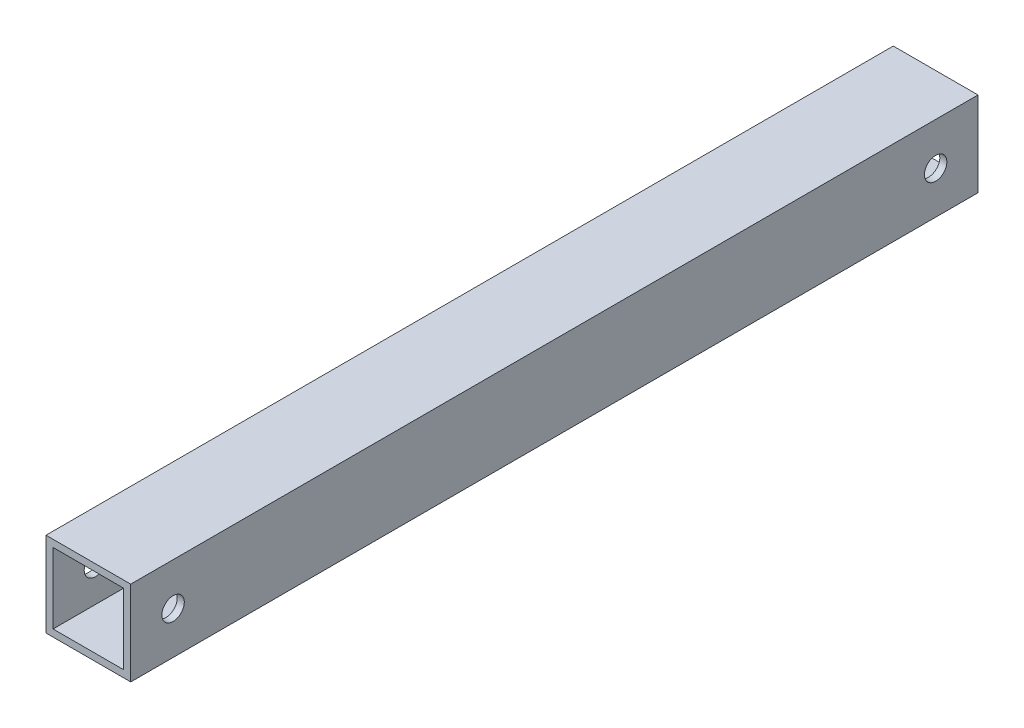
ISO-10303-21;
HEADER;
FILE_DESCRIPTION(('STEP AP214'),'2;1');
FILE_NAME('part.step','',(''),(''),'','','');
FILE_SCHEMA(('AUTOMOTIVE_DESIGN { 1 0 10303 214 1 1 1 1 }'));
ENDSEC;
DATA;
#1=APPLICATION_CONTEXT('core data for automotive mechanical design processes');
#2=APPLICATION_PROTOCOL_DEFINITION('international standard','automotive_design',2000,#1);
#3=PRODUCT_CONTEXT('',#1,'mechanical');
#4=PRODUCT('Part','Part','',(#3));
#5=PRODUCT_RELATED_PRODUCT_CATEGORY('part','',(#4));
#6=PRODUCT_DEFINITION_FORMATION('','',#4);
#7=PRODUCT_DEFINITION_CONTEXT('part definition',#1,'design');
#8=PRODUCT_DEFINITION('design','',#6,#7);
#9=PRODUCT_DEFINITION_SHAPE('','',#8);
#10=(LENGTH_UNIT() NAMED_UNIT(*) SI_UNIT(.MILLI.,.METRE.));
#11=(NAMED_UNIT(*) PLANE_ANGLE_UNIT() SI_UNIT($,.RADIAN.));
#12=(NAMED_UNIT(*) SI_UNIT($,.STERADIAN.) SOLID_ANGLE_UNIT());
#13=UNCERTAINTY_MEASURE_WITH_UNIT(LENGTH_MEASURE(1.E-05),#10,'distance_accuracy_value','');
#14=(GEOMETRIC_REPRESENTATION_CONTEXT(3) GLOBAL_UNCERTAINTY_ASSIGNED_CONTEXT((#13)) GLOBAL_UNIT_ASSIGNED_CONTEXT((#10,
#11,#12)) REPRESENTATION_CONTEXT('',''));
#15=CARTESIAN_POINT('',(0.,0.,0.));
#16=DIRECTION('',(0.,0.,1.));
#17=DIRECTION('',(1.,0.,0.));
#18=AXIS2_PLACEMENT_3D('',#15,#16,#17);
#19=CARTESIAN_POINT('',(0.,0.,381.));
#20=DIRECTION('',(0.,0.,-1.));
#21=DIRECTION('',(-1.,0.,0.));
#22=AXIS2_PLACEMENT_3D('',#19,#20,#21);
#23=PLANE('',#22);
#24=DIRECTION('',(0.,-1.,0.));
#25=VECTOR('',#24,1.);
#26=CARTESIAN_POINT('',(0.,0.,381.));
#27=LINE('',#26,#25);
#28=CARTESIAN_POINT('',(0.,38.1,381.));
#29=VERTEX_POINT('',#28);
#30=CARTESIAN_POINT('',(0.,0.,381.));
#31=VERTEX_POINT('',#30);
#32=EDGE_CURVE('E140',#29,#31,#27,.T.);
#33=ORIENTED_EDGE('',*,*,#32,.T.);
#34=DIRECTION('',(1.,0.,0.));
#35=VECTOR('',#34,1.);
#36=CARTESIAN_POINT('',(0.,0.,381.));
#37=LINE('',#36,#35);
#38=CARTESIAN_POINT('',(38.1,0.,381.));
#39=VERTEX_POINT('',#38);
#40=EDGE_CURVE('E143',#31,#39,#37,.T.);
#41=ORIENTED_EDGE('',*,*,#40,.T.);
#42=DIRECTION('',(0.,1.,0.));
#43=VECTOR('',#42,1.);
#44=CARTESIAN_POINT('',(38.1,0.,381.));
#45=LINE('',#44,#43);
#46=CARTESIAN_POINT('',(38.1,38.1,381.));
#47=VERTEX_POINT('',#46);
#48=EDGE_CURVE('E146',#39,#47,#45,.T.);
#49=ORIENTED_EDGE('',*,*,#48,.T.);
#50=DIRECTION('',(-1.,0.,0.));
#51=VECTOR('',#50,1.);
#52=CARTESIAN_POINT('',(0.,38.1,381.));
#53=LINE('',#52,#51);
#54=EDGE_CURVE('E148',#47,#29,#53,.T.);
#55=ORIENTED_EDGE('',*,*,#54,.T.);
#56=EDGE_LOOP('',(#33,#41,#49,#55));
#57=FACE_BOUND('',#56,.T.);
#58=DIRECTION('',(0.,-1.,0.));
#59=VECTOR('',#58,1.);
#60=CARTESIAN_POINT('',(3.175,3.175,381.));
#61=LINE('',#60,#59);
#62=CARTESIAN_POINT('',(3.175,34.925,381.));
#63=VERTEX_POINT('',#62);
#64=CARTESIAN_POINT('',(3.175,3.175,381.));
#65=VERTEX_POINT('',#64);
#66=EDGE_CURVE('E102',#63,#65,#61,.T.);
#67=ORIENTED_EDGE('',*,*,#66,.F.);
#68=DIRECTION('',(-1.,0.,0.));
#69=VECTOR('',#68,1.);
#70=CARTESIAN_POINT('',(3.175,34.925,381.));
#71=LINE('',#70,#69);
#72=CARTESIAN_POINT('',(34.925,34.925,381.));
#73=VERTEX_POINT('',#72);
#74=EDGE_CURVE('E124',#73,#63,#71,.T.);
#75=ORIENTED_EDGE('',*,*,#74,.F.);
#76=DIRECTION('',(0.,1.,0.));
#77=VECTOR('',#76,1.);
#78=CARTESIAN_POINT('',(34.925,3.175,381.));
#79=LINE('',#78,#77);
#80=CARTESIAN_POINT('',(34.925,3.175,381.));
#81=VERTEX_POINT('',#80);
#82=EDGE_CURVE('E122',#81,#73,#79,.T.);
#83=ORIENTED_EDGE('',*,*,#82,.F.);
#84=DIRECTION('',(1.,0.,0.));
#85=VECTOR('',#84,1.);
#86=CARTESIAN_POINT('',(3.175,3.175,381.));
#87=LINE('',#86,#85);
#88=EDGE_CURVE('E110',#65,#81,#87,.T.);
#89=ORIENTED_EDGE('',*,*,#88,.F.);
#90=EDGE_LOOP('',(#67,#75,#83,#89));
#91=FACE_BOUND('',#90,.T.);
#92=ADVANCED_FACE('F35',(#57,#91),#23,.F.);
#93=CARTESIAN_POINT('',(0.,0.,0.));
#94=DIRECTION('',(0.,0.,-1.));
#95=DIRECTION('',(-1.,0.,0.));
#96=AXIS2_PLACEMENT_3D('',#93,#94,#95);
#97=PLANE('',#96);
#98=DIRECTION('',(0.,-1.,0.));
#99=VECTOR('',#98,1.);
#100=CARTESIAN_POINT('',(0.,0.,0.));
#101=LINE('',#100,#99);
#102=CARTESIAN_POINT('',(0.,38.1,0.));
#103=VERTEX_POINT('',#102);
#104=CARTESIAN_POINT('',(0.,0.,0.));
#105=VERTEX_POINT('',#104);
#106=EDGE_CURVE('E118',#103,#105,#101,.T.);
#107=ORIENTED_EDGE('',*,*,#106,.F.);
#108=DIRECTION('',(-1.,0.,0.));
#109=VECTOR('',#108,1.);
#110=CARTESIAN_POINT('',(0.,38.1,0.));
#111=LINE('',#110,#109);
#112=CARTESIAN_POINT('',(38.1,38.1,0.));
#113=VERTEX_POINT('',#112);
#114=EDGE_CURVE('E144',#113,#103,#111,.T.);
#115=ORIENTED_EDGE('',*,*,#114,.F.);
#116=DIRECTION('',(0.,1.,0.));
#117=VECTOR('',#116,1.);
#118=CARTESIAN_POINT('',(38.1,0.,0.));
#119=LINE('',#118,#117);
#120=CARTESIAN_POINT('',(38.1,0.,0.));
#121=VERTEX_POINT('',#120);
#122=EDGE_CURVE('E155',#121,#113,#119,.T.);
#123=ORIENTED_EDGE('',*,*,#122,.F.);
#124=DIRECTION('',(1.,0.,0.));
#125=VECTOR('',#124,1.);
#126=CARTESIAN_POINT('',(0.,0.,0.));
#127=LINE('',#126,#125);
#128=EDGE_CURVE('E153',#105,#121,#127,.T.);
#129=ORIENTED_EDGE('',*,*,#128,.F.);
#130=EDGE_LOOP('',(#107,#115,#123,#129));
#131=FACE_BOUND('',#130,.T.);
#132=DIRECTION('',(-1.,0.,0.));
#133=VECTOR('',#132,1.);
#134=CARTESIAN_POINT('',(3.175,34.925,0.));
#135=LINE('',#134,#133);
#136=CARTESIAN_POINT('',(34.925,34.925,0.));
#137=VERTEX_POINT('',#136);
#138=CARTESIAN_POINT('',(3.175,34.925,0.));
#139=VERTEX_POINT('',#138);
#140=EDGE_CURVE('E111',#137,#139,#135,.T.);
#141=ORIENTED_EDGE('',*,*,#140,.T.);
#142=DIRECTION('',(0.,-1.,0.));
#143=VECTOR('',#142,1.);
#144=CARTESIAN_POINT('',(3.175,3.175,0.));
#145=LINE('',#144,#143);
#146=CARTESIAN_POINT('',(3.175,3.175,0.));
#147=VERTEX_POINT('',#146);
#148=EDGE_CURVE('E60',#139,#147,#145,.T.);
#149=ORIENTED_EDGE('',*,*,#148,.T.);
#150=DIRECTION('',(1.,0.,0.));
#151=VECTOR('',#150,1.);
#152=CARTESIAN_POINT('',(3.175,3.175,0.));
#153=LINE('',#152,#151);
#154=CARTESIAN_POINT('',(34.925,3.175,0.));
#155=VERTEX_POINT('',#154);
#156=EDGE_CURVE('E117',#147,#155,#153,.T.);
#157=ORIENTED_EDGE('',*,*,#156,.T.);
#158=DIRECTION('',(0.,1.,0.));
#159=VECTOR('',#158,1.);
#160=CARTESIAN_POINT('',(34.925,3.175,0.));
#161=LINE('',#160,#159);
#162=EDGE_CURVE('E132',#155,#137,#161,.T.);
#163=ORIENTED_EDGE('',*,*,#162,.T.);
#164=EDGE_LOOP('',(#141,#149,#157,#163));
#165=FACE_BOUND('',#164,.T.);
#166=ADVANCED_FACE('F193',(#131,#165),#97,.T.);
#167=CARTESIAN_POINT('',(0.,0.,381.));
#168=DIRECTION('',(1.,0.,0.));
#169=DIRECTION('',(0.,0.,-1.));
#170=AXIS2_PLACEMENT_3D('',#167,#168,#169);
#171=PLANE('',#170);
#172=CARTESIAN_POINT('',(0.,19.05,19.05));
#173=DIRECTION('',(-1.,0.,0.));
#174=DIRECTION('',(0.,0.,1.));
#175=AXIS2_PLACEMENT_3D('',#172,#173,#174);
#176=CIRCLE('',#175,5.04189999999999);
#177=CARTESIAN_POINT('',(0.,19.05,24.0919));
#178=VERTEX_POINT('',#177);
#179=EDGE_CURVE('E184',#178,#178,#176,.T.);
#180=ORIENTED_EDGE('',*,*,#179,.F.);
#181=EDGE_LOOP('',(#180));
#182=FACE_BOUND('',#181,.T.);
#183=CARTESIAN_POINT('',(0.,19.05,361.95));
#184=DIRECTION('',(-1.,0.,0.));
#185=DIRECTION('',(0.,0.,1.));
#186=AXIS2_PLACEMENT_3D('',#183,#184,#185);
#187=CIRCLE('',#186,5.04189999999999);
#188=CARTESIAN_POINT('',(0.,19.05,366.9919));
#189=VERTEX_POINT('',#188);
#190=EDGE_CURVE('E171',#189,#189,#187,.T.);
#191=ORIENTED_EDGE('',*,*,#190,.F.);
#192=EDGE_LOOP('',(#191));
#193=FACE_BOUND('',#192,.T.);
#194=ORIENTED_EDGE('',*,*,#106,.T.);
#195=DIRECTION('',(0.,0.,-1.));
#196=VECTOR('',#195,1.);
#197=CARTESIAN_POINT('',(0.,0.,381.));
#198=LINE('',#197,#196);
#199=EDGE_CURVE('E11',#31,#105,#198,.T.);
#200=ORIENTED_EDGE('',*,*,#199,.F.);
#201=ORIENTED_EDGE('',*,*,#32,.F.);
#202=DIRECTION('',(0.,0.,-1.));
#203=VECTOR('',#202,1.);
#204=CARTESIAN_POINT('',(0.,38.1,381.));
#205=LINE('',#204,#203);
#206=EDGE_CURVE('E150',#29,#103,#205,.T.);
#207=ORIENTED_EDGE('',*,*,#206,.T.);
#208=EDGE_LOOP('',(#194,#200,#201,#207));
#209=FACE_BOUND('',#208,.T.);
#210=ADVANCED_FACE('F37',(#182,#193,#209),#171,.F.);
#211=CARTESIAN_POINT('',(0.,0.,381.));
#212=DIRECTION('',(0.,1.,0.));
#213=DIRECTION('',(0.,0.,1.));
#214=AXIS2_PLACEMENT_3D('',#211,#212,#213);
#215=PLANE('',#214);
#216=ORIENTED_EDGE('',*,*,#128,.T.);
#217=DIRECTION('',(0.,0.,-1.));
#218=VECTOR('',#217,1.);
#219=CARTESIAN_POINT('',(38.1,0.,381.));
#220=LINE('',#219,#218);
#221=EDGE_CURVE('E44',#39,#121,#220,.T.);
#222=ORIENTED_EDGE('',*,*,#221,.F.);
#223=ORIENTED_EDGE('',*,*,#40,.F.);
#224=ORIENTED_EDGE('',*,*,#199,.T.);
#225=EDGE_LOOP('',(#216,#222,#223,#224));
#226=FACE_BOUND('',#225,.T.);
#227=ADVANCED_FACE('F192',(#226),#215,.F.);
#228=CARTESIAN_POINT('',(38.1,0.,381.));
#229=DIRECTION('',(-1.,0.,0.));
#230=DIRECTION('',(0.,0.,1.));
#231=AXIS2_PLACEMENT_3D('',#228,#229,#230);
#232=PLANE('',#231);
#233=CARTESIAN_POINT('',(38.1,19.05,19.05));
#234=DIRECTION('',(-1.,0.,0.));
#235=DIRECTION('',(0.,0.,1.));
#236=AXIS2_PLACEMENT_3D('',#233,#234,#235);
#237=CIRCLE('',#236,5.04189999999999);
#238=CARTESIAN_POINT('',(38.1,19.05,24.0919));
#239=VERTEX_POINT('',#238);
#240=EDGE_CURVE('E181',#239,#239,#237,.T.);
#241=ORIENTED_EDGE('',*,*,#240,.T.);
#242=EDGE_LOOP('',(#241));
#243=FACE_BOUND('',#242,.T.);
#244=CARTESIAN_POINT('',(38.1,19.05,361.95));
#245=DIRECTION('',(-1.,0.,0.));
#246=DIRECTION('',(0.,0.,1.));
#247=AXIS2_PLACEMENT_3D('',#244,#245,#246);
#248=CIRCLE('',#247,5.04189999999999);
#249=CARTESIAN_POINT('',(38.1,19.05,366.9919));
#250=VERTEX_POINT('',#249);
#251=EDGE_CURVE('E166',#250,#250,#248,.T.);
#252=ORIENTED_EDGE('',*,*,#251,.T.);
#253=EDGE_LOOP('',(#252));
#254=FACE_BOUND('',#253,.T.);
#255=ORIENTED_EDGE('',*,*,#122,.T.);
#256=DIRECTION('',(0.,0.,-1.));
#257=VECTOR('',#256,1.);
#258=CARTESIAN_POINT('',(38.1,38.1,381.));
#259=LINE('',#258,#257);
#260=EDGE_CURVE('E160',#47,#113,#259,.T.);
#261=ORIENTED_EDGE('',*,*,#260,.F.);
#262=ORIENTED_EDGE('',*,*,#48,.F.);
#263=ORIENTED_EDGE('',*,*,#221,.T.);
#264=EDGE_LOOP('',(#255,#261,#262,#263));
#265=FACE_BOUND('',#264,.T.);
#266=ADVANCED_FACE('F213',(#243,#254,#265),#232,.F.);
#267=CARTESIAN_POINT('',(0.,38.1,381.));
#268=DIRECTION('',(0.,-1.,0.));
#269=DIRECTION('',(0.,0.,-1.));
#270=AXIS2_PLACEMENT_3D('',#267,#268,#269);
#271=PLANE('',#270);
#272=ORIENTED_EDGE('',*,*,#114,.T.);
#273=ORIENTED_EDGE('',*,*,#206,.F.);
#274=ORIENTED_EDGE('',*,*,#54,.F.);
#275=ORIENTED_EDGE('',*,*,#260,.T.);
#276=EDGE_LOOP('',(#272,#273,#274,#275));
#277=FACE_BOUND('',#276,.T.);
#278=ADVANCED_FACE('F211',(#277),#271,.F.);
#279=CARTESIAN_POINT('',(3.175,3.175,381.));
#280=DIRECTION('',(1.,0.,0.));
#281=DIRECTION('',(0.,1.,0.));
#282=AXIS2_PLACEMENT_3D('',#279,#280,#281);
#283=PLANE('',#282);
#284=CARTESIAN_POINT('',(3.175,19.05,19.05));
#285=DIRECTION('',(1.,0.,0.));
#286=DIRECTION('',(0.,1.,0.));
#287=AXIS2_PLACEMENT_3D('',#284,#285,#286);
#288=CIRCLE('',#287,5.04189999999999);
#289=CARTESIAN_POINT('',(3.175,24.0919,19.05));
#290=VERTEX_POINT('',#289);
#291=EDGE_CURVE('E176',#290,#290,#288,.T.);
#292=ORIENTED_EDGE('',*,*,#291,.F.);
#293=EDGE_LOOP('',(#292));
#294=FACE_BOUND('',#293,.T.);
#295=CARTESIAN_POINT('',(3.175,19.05,361.95));
#296=DIRECTION('',(1.,0.,0.));
#297=DIRECTION('',(0.,1.,0.));
#298=AXIS2_PLACEMENT_3D('',#295,#296,#297);
#299=CIRCLE('',#298,5.04189999999999);
#300=CARTESIAN_POINT('',(3.175,24.0919,361.95));
#301=VERTEX_POINT('',#300);
#302=EDGE_CURVE('E130',#301,#301,#299,.T.);
#303=ORIENTED_EDGE('',*,*,#302,.F.);
#304=EDGE_LOOP('',(#303));
#305=FACE_BOUND('',#304,.T.);
#306=ORIENTED_EDGE('',*,*,#148,.F.);
#307=DIRECTION('',(0.,0.,-1.));
#308=VECTOR('',#307,1.);
#309=CARTESIAN_POINT('',(3.175,34.925,381.));
#310=LINE('',#309,#308);
#311=EDGE_CURVE('E106',#63,#139,#310,.T.);
#312=ORIENTED_EDGE('',*,*,#311,.F.);
#313=ORIENTED_EDGE('',*,*,#66,.T.);
#314=DIRECTION('',(0.,0.,-1.));
#315=VECTOR('',#314,1.);
#316=CARTESIAN_POINT('',(3.175,3.175,381.));
#317=LINE('',#316,#315);
#318=EDGE_CURVE('E105',#65,#147,#317,.T.);
#319=ORIENTED_EDGE('',*,*,#318,.T.);
#320=EDGE_LOOP('',(#306,#312,#313,#319));
#321=FACE_BOUND('',#320,.T.);
#322=ADVANCED_FACE('F104',(#294,#305,#321),#283,.T.);
#323=CARTESIAN_POINT('',(3.175,3.175,381.));
#324=DIRECTION('',(0.,1.,0.));
#325=DIRECTION('',(0.,0.,1.));
#326=AXIS2_PLACEMENT_3D('',#323,#324,#325);
#327=PLANE('',#326);
#328=ORIENTED_EDGE('',*,*,#156,.F.);
#329=ORIENTED_EDGE('',*,*,#318,.F.);
#330=ORIENTED_EDGE('',*,*,#88,.T.);
#331=DIRECTION('',(0.,0.,-1.));
#332=VECTOR('',#331,1.);
#333=CARTESIAN_POINT('',(34.925,3.175,381.));
#334=LINE('',#333,#332);
#335=EDGE_CURVE('E119',#81,#155,#334,.T.);
#336=ORIENTED_EDGE('',*,*,#335,.T.);
#337=EDGE_LOOP('',(#328,#329,#330,#336));
#338=FACE_BOUND('',#337,.T.);
#339=ADVANCED_FACE('F114',(#338),#327,.T.);
#340=CARTESIAN_POINT('',(34.925,3.175,381.));
#341=DIRECTION('',(-1.,0.,0.));
#342=DIRECTION('',(0.,0.,1.));
#343=AXIS2_PLACEMENT_3D('',#340,#341,#342);
#344=PLANE('',#343);
#345=CARTESIAN_POINT('',(34.925,19.05,19.05));
#346=DIRECTION('',(-1.,0.,0.));
#347=DIRECTION('',(0.,0.,1.));
#348=AXIS2_PLACEMENT_3D('',#345,#346,#347);
#349=CIRCLE('',#348,5.04189999999999);
#350=CARTESIAN_POINT('',(34.925,19.05,24.0919));
#351=VERTEX_POINT('',#350);
#352=EDGE_CURVE('E39',#351,#351,#349,.T.);
#353=ORIENTED_EDGE('',*,*,#352,.F.);
#354=EDGE_LOOP('',(#353));
#355=FACE_BOUND('',#354,.T.);
#356=CARTESIAN_POINT('',(34.925,19.05,361.95));
#357=DIRECTION('',(-1.,0.,0.));
#358=DIRECTION('',(0.,0.,1.));
#359=AXIS2_PLACEMENT_3D('',#356,#357,#358);
#360=CIRCLE('',#359,5.04189999999999);
#361=CARTESIAN_POINT('',(34.925,19.05,366.9919));
#362=VERTEX_POINT('',#361);
#363=EDGE_CURVE('E164',#362,#362,#360,.T.);
#364=ORIENTED_EDGE('',*,*,#363,.F.);
#365=EDGE_LOOP('',(#364));
#366=FACE_BOUND('',#365,.T.);
#367=ORIENTED_EDGE('',*,*,#162,.F.);
#368=ORIENTED_EDGE('',*,*,#335,.F.);
#369=ORIENTED_EDGE('',*,*,#82,.T.);
#370=DIRECTION('',(0.,0.,-1.));
#371=VECTOR('',#370,1.);
#372=CARTESIAN_POINT('',(34.925,34.925,381.));
#373=LINE('',#372,#371);
#374=EDGE_CURVE('E52',#73,#137,#373,.T.);
#375=ORIENTED_EDGE('',*,*,#374,.T.);
#376=EDGE_LOOP('',(#367,#368,#369,#375));
#377=FACE_BOUND('',#376,.T.);
#378=ADVANCED_FACE('F234',(#355,#366,#377),#344,.T.);
#379=CARTESIAN_POINT('',(3.175,34.925,381.));
#380=DIRECTION('',(0.,-1.,0.));
#381=DIRECTION('',(0.,0.,-1.));
#382=AXIS2_PLACEMENT_3D('',#379,#380,#381);
#383=PLANE('',#382);
#384=ORIENTED_EDGE('',*,*,#140,.F.);
#385=ORIENTED_EDGE('',*,*,#374,.F.);
#386=ORIENTED_EDGE('',*,*,#74,.T.);
#387=ORIENTED_EDGE('',*,*,#311,.T.);
#388=EDGE_LOOP('',(#384,#385,#386,#387));
#389=FACE_BOUND('',#388,.T.);
#390=ADVANCED_FACE('F237',(#389),#383,.T.);
#391=CARTESIAN_POINT('',(0.,19.05,361.95));
#392=DIRECTION('',(-1.,0.,0.));
#393=DIRECTION('',(0.,0.,1.));
#394=AXIS2_PLACEMENT_3D('',#391,#392,#393);
#395=CYLINDRICAL_SURFACE('',#394,5.04189999999999);
#396=ORIENTED_EDGE('',*,*,#363,.T.);
#397=EDGE_LOOP('',(#396));
#398=FACE_BOUND('',#397,.T.);
#399=ORIENTED_EDGE('',*,*,#251,.F.);
#400=EDGE_LOOP('',(#399));
#401=FACE_BOUND('',#400,.T.);
#402=ADVANCED_FACE('F241',(#398,#401),#395,.F.);
#403=ORIENTED_EDGE('',*,*,#302,.T.);
#404=EDGE_LOOP('',(#403));
#405=FACE_BOUND('',#404,.T.);
#406=ORIENTED_EDGE('',*,*,#190,.T.);
#407=EDGE_LOOP('',(#406));
#408=FACE_BOUND('',#407,.T.);
#409=ADVANCED_FACE('F244',(#405,#408),#395,.F.);
#410=CARTESIAN_POINT('',(0.,19.05,19.05));
#411=DIRECTION('',(-1.,0.,0.));
#412=DIRECTION('',(0.,0.,1.));
#413=AXIS2_PLACEMENT_3D('',#410,#411,#412);
#414=CYLINDRICAL_SURFACE('',#413,5.04189999999999);
#415=ORIENTED_EDGE('',*,*,#352,.T.);
#416=EDGE_LOOP('',(#415));
#417=FACE_BOUND('',#416,.T.);
#418=ORIENTED_EDGE('',*,*,#240,.F.);
#419=EDGE_LOOP('',(#418));
#420=FACE_BOUND('',#419,.T.);
#421=ADVANCED_FACE('F245',(#417,#420),#414,.F.);
#422=ORIENTED_EDGE('',*,*,#291,.T.);
#423=EDGE_LOOP('',(#422));
#424=FACE_BOUND('',#423,.T.);
#425=ORIENTED_EDGE('',*,*,#179,.T.);
#426=EDGE_LOOP('',(#425));
#427=FACE_BOUND('',#426,.T.);
#428=ADVANCED_FACE('F188',(#424,#427),#414,.F.);
#429=CLOSED_SHELL('',(#92,#166,#210,#227,#266,#278,#322,#339,#378,#390,#402,#409,#421,#428));
#430=MANIFOLD_SOLID_BREP('B2',#429);
#431=ADVANCED_BREP_SHAPE_REPRESENTATION('',(#18,#430),#14);
#432=SHAPE_DEFINITION_REPRESENTATION(#9,#431);
ENDSEC;
END-ISO-10303-21;
